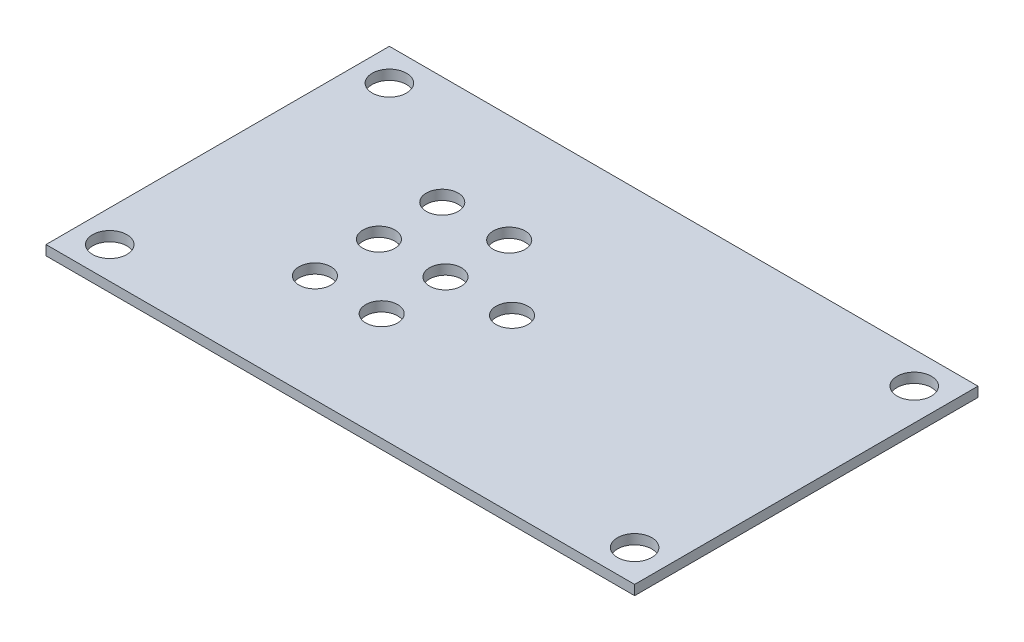
ISO-10303-21;
HEADER;
FILE_DESCRIPTION(('STEP AP214'),'2;1');
FILE_NAME('part.step','',(''),(''),'','','');
FILE_SCHEMA(('AUTOMOTIVE_DESIGN { 1 0 10303 214 1 1 1 1 }'));
ENDSEC;
DATA;
#1=APPLICATION_CONTEXT('core data for automotive mechanical design processes');
#2=APPLICATION_PROTOCOL_DEFINITION('international standard','automotive_design',2000,#1);
#3=PRODUCT_CONTEXT('',#1,'mechanical');
#4=PRODUCT('Part','Part','',(#3));
#5=PRODUCT_RELATED_PRODUCT_CATEGORY('part','',(#4));
#6=PRODUCT_DEFINITION_FORMATION('','',#4);
#7=PRODUCT_DEFINITION_CONTEXT('part definition',#1,'design');
#8=PRODUCT_DEFINITION('design','',#6,#7);
#9=PRODUCT_DEFINITION_SHAPE('','',#8);
#10=(LENGTH_UNIT() NAMED_UNIT(*) SI_UNIT(.MILLI.,.METRE.));
#11=(NAMED_UNIT(*) PLANE_ANGLE_UNIT() SI_UNIT($,.RADIAN.));
#12=(NAMED_UNIT(*) SI_UNIT($,.STERADIAN.) SOLID_ANGLE_UNIT());
#13=UNCERTAINTY_MEASURE_WITH_UNIT(LENGTH_MEASURE(1.E-05),#10,'distance_accuracy_value','');
#14=(GEOMETRIC_REPRESENTATION_CONTEXT(3) GLOBAL_UNCERTAINTY_ASSIGNED_CONTEXT((#13)) GLOBAL_UNIT_ASSIGNED_CONTEXT((#10,
#11,#12)) REPRESENTATION_CONTEXT('',''));
#15=CARTESIAN_POINT('',(0.,0.,0.));
#16=DIRECTION('',(0.,0.,1.));
#17=DIRECTION('',(1.,0.,0.));
#18=AXIS2_PLACEMENT_3D('',#15,#16,#17);
#19=CARTESIAN_POINT('',(-60.,2.,-35.));
#20=DIRECTION('',(0.,0.,-1.));
#21=DIRECTION('',(-1.,0.,0.));
#22=AXIS2_PLACEMENT_3D('',#19,#20,#21);
#23=PLANE('',#22);
#24=DIRECTION('',(1.,0.,0.));
#25=VECTOR('',#24,1.);
#26=CARTESIAN_POINT('',(-60.,0.,-35.));
#27=LINE('',#26,#25);
#28=CARTESIAN_POINT('',(-60.,0.,-35.));
#29=VERTEX_POINT('',#28);
#30=CARTESIAN_POINT('',(60.,0.,-35.));
#31=VERTEX_POINT('',#30);
#32=EDGE_CURVE('E104',#29,#31,#27,.T.);
#33=ORIENTED_EDGE('',*,*,#32,.F.);
#34=DIRECTION('',(0.,-1.,0.));
#35=VECTOR('',#34,1.);
#36=CARTESIAN_POINT('',(-60.,2.,-35.));
#37=LINE('',#36,#35);
#38=CARTESIAN_POINT('',(-60.,2.,-35.));
#39=VERTEX_POINT('',#38);
#40=EDGE_CURVE('E51',#39,#29,#37,.T.);
#41=ORIENTED_EDGE('',*,*,#40,.F.);
#42=DIRECTION('',(1.,0.,0.));
#43=VECTOR('',#42,1.);
#44=CARTESIAN_POINT('',(-60.,2.,-35.));
#45=LINE('',#44,#43);
#46=CARTESIAN_POINT('',(60.,2.,-35.));
#47=VERTEX_POINT('',#46);
#48=EDGE_CURVE('E98',#39,#47,#45,.T.);
#49=ORIENTED_EDGE('',*,*,#48,.T.);
#50=DIRECTION('',(0.,-1.,0.));
#51=VECTOR('',#50,1.);
#52=CARTESIAN_POINT('',(60.,2.,-35.));
#53=LINE('',#52,#51);
#54=EDGE_CURVE('E76',#47,#31,#53,.T.);
#55=ORIENTED_EDGE('',*,*,#54,.T.);
#56=EDGE_LOOP('',(#33,#41,#49,#55));
#57=FACE_BOUND('',#56,.T.);
#58=ADVANCED_FACE('F33',(#57),#23,.T.);
#59=CARTESIAN_POINT('',(-60.,2.,-35.));
#60=DIRECTION('',(1.,0.,0.));
#61=DIRECTION('',(0.,0.,-1.));
#62=AXIS2_PLACEMENT_3D('',#59,#60,#61);
#63=PLANE('',#62);
#64=DIRECTION('',(0.,0.,1.));
#65=VECTOR('',#64,1.);
#66=CARTESIAN_POINT('',(-60.,0.,-35.));
#67=LINE('',#66,#65);
#68=CARTESIAN_POINT('',(-60.,0.,35.));
#69=VERTEX_POINT('',#68);
#70=EDGE_CURVE('E68',#29,#69,#67,.T.);
#71=ORIENTED_EDGE('',*,*,#70,.T.);
#72=DIRECTION('',(0.,-1.,0.));
#73=VECTOR('',#72,1.);
#74=CARTESIAN_POINT('',(-60.,2.,35.));
#75=LINE('',#74,#73);
#76=CARTESIAN_POINT('',(-60.,2.,35.));
#77=VERTEX_POINT('',#76);
#78=EDGE_CURVE('E95',#77,#69,#75,.T.);
#79=ORIENTED_EDGE('',*,*,#78,.F.);
#80=DIRECTION('',(0.,0.,1.));
#81=VECTOR('',#80,1.);
#82=CARTESIAN_POINT('',(-60.,2.,-35.));
#83=LINE('',#82,#81);
#84=EDGE_CURVE('E86',#39,#77,#83,.T.);
#85=ORIENTED_EDGE('',*,*,#84,.F.);
#86=ORIENTED_EDGE('',*,*,#40,.T.);
#87=EDGE_LOOP('',(#71,#79,#85,#86));
#88=FACE_BOUND('',#87,.T.);
#89=ADVANCED_FACE('F189',(#88),#63,.F.);
#90=CARTESIAN_POINT('',(-60.,2.,35.));
#91=DIRECTION('',(0.,0.,-1.));
#92=DIRECTION('',(-1.,0.,0.));
#93=AXIS2_PLACEMENT_3D('',#90,#91,#92);
#94=PLANE('',#93);
#95=DIRECTION('',(1.,0.,0.));
#96=VECTOR('',#95,1.);
#97=CARTESIAN_POINT('',(-60.,0.,35.));
#98=LINE('',#97,#96);
#99=CARTESIAN_POINT('',(60.,0.,35.));
#100=VERTEX_POINT('',#99);
#101=EDGE_CURVE('E93',#69,#100,#98,.T.);
#102=ORIENTED_EDGE('',*,*,#101,.T.);
#103=DIRECTION('',(0.,-1.,0.));
#104=VECTOR('',#103,1.);
#105=CARTESIAN_POINT('',(60.,2.,35.));
#106=LINE('',#105,#104);
#107=CARTESIAN_POINT('',(60.,2.,35.));
#108=VERTEX_POINT('',#107);
#109=EDGE_CURVE('E90',#108,#100,#106,.T.);
#110=ORIENTED_EDGE('',*,*,#109,.F.);
#111=DIRECTION('',(1.,0.,0.));
#112=VECTOR('',#111,1.);
#113=CARTESIAN_POINT('',(-60.,2.,35.));
#114=LINE('',#113,#112);
#115=EDGE_CURVE('E81',#77,#108,#114,.T.);
#116=ORIENTED_EDGE('',*,*,#115,.F.);
#117=ORIENTED_EDGE('',*,*,#78,.T.);
#118=EDGE_LOOP('',(#102,#110,#116,#117));
#119=FACE_BOUND('',#118,.T.);
#120=ADVANCED_FACE('F91',(#119),#94,.F.);
#121=CARTESIAN_POINT('',(60.,2.,-35.));
#122=DIRECTION('',(1.,0.,0.));
#123=DIRECTION('',(0.,0.,-1.));
#124=AXIS2_PLACEMENT_3D('',#121,#122,#123);
#125=PLANE('',#124);
#126=DIRECTION('',(0.,0.,1.));
#127=VECTOR('',#126,1.);
#128=CARTESIAN_POINT('',(60.,0.,-35.));
#129=LINE('',#128,#127);
#130=EDGE_CURVE('E107',#31,#100,#129,.T.);
#131=ORIENTED_EDGE('',*,*,#130,.F.);
#132=ORIENTED_EDGE('',*,*,#54,.F.);
#133=DIRECTION('',(0.,0.,1.));
#134=VECTOR('',#133,1.);
#135=CARTESIAN_POINT('',(60.,2.,-35.));
#136=LINE('',#135,#134);
#137=EDGE_CURVE('E85',#47,#108,#136,.T.);
#138=ORIENTED_EDGE('',*,*,#137,.T.);
#139=ORIENTED_EDGE('',*,*,#109,.T.);
#140=EDGE_LOOP('',(#131,#132,#138,#139));
#141=FACE_BOUND('',#140,.T.);
#142=ADVANCED_FACE('F97',(#141),#125,.T.);
#143=CARTESIAN_POINT('',(0.,2.,0.));
#144=DIRECTION('',(0.,-1.,0.));
#145=DIRECTION('',(0.,0.,-1.));
#146=AXIS2_PLACEMENT_3D('',#143,#144,#145);
#147=PLANE('',#146);
#148=CARTESIAN_POINT('',(-13.5670814838794,2.,13.));
#149=DIRECTION('',(0.,1.,0.));
#150=DIRECTION('',(0.,0.,1.));
#151=AXIS2_PLACEMENT_3D('',#148,#149,#150);
#152=CIRCLE('',#151,3.25);
#153=CARTESIAN_POINT('',(-13.5670814838794,2.,16.25));
#154=VERTEX_POINT('',#153);
#155=EDGE_CURVE('E367',#154,#154,#152,.T.);
#156=ORIENTED_EDGE('',*,*,#155,.F.);
#157=EDGE_LOOP('',(#156));
#158=FACE_BOUND('',#157,.T.);
#159=CARTESIAN_POINT('',(-27.0544480874395,2.,13.1222734091497));
#160=DIRECTION('',(0.,1.,0.));
#161=DIRECTION('',(0.,0.,1.));
#162=AXIS2_PLACEMENT_3D('',#159,#160,#161);
#163=CIRCLE('',#162,3.25);
#164=CARTESIAN_POINT('',(-27.0544480874395,2.,16.3722734091497));
#165=VERTEX_POINT('',#164);
#166=EDGE_CURVE('E368',#165,#165,#163,.T.);
#167=ORIENTED_EDGE('',*,*,#166,.F.);
#168=EDGE_LOOP('',(#167));
#169=FACE_BOUND('',#168,.T.);
#170=CARTESIAN_POINT('',(-27.0234830475948,2.,0.107647129916502));
#171=DIRECTION('',(0.,1.,0.));
#172=DIRECTION('',(0.,0.,1.));
#173=AXIS2_PLACEMENT_3D('',#170,#171,#172);
#174=CIRCLE('',#173,3.25);
#175=CARTESIAN_POINT('',(-27.0234830475948,2.,3.3576471299165));
#176=VERTEX_POINT('',#175);
#177=EDGE_CURVE('E370',#176,#176,#174,.T.);
#178=ORIENTED_EDGE('',*,*,#177,.F.);
#179=EDGE_LOOP('',(#178));
#180=FACE_BOUND('',#179,.T.);
#181=CARTESIAN_POINT('',(-27.0815622735967,2.,-12.8640198972437));
#182=DIRECTION('',(0.,1.,0.));
#183=DIRECTION('',(0.,0.,1.));
#184=AXIS2_PLACEMENT_3D('',#181,#182,#183);
#185=CIRCLE('',#184,3.25);
#186=CARTESIAN_POINT('',(-27.0815622735967,2.,-9.6140198972437));
#187=VERTEX_POINT('',#186);
#188=EDGE_CURVE('E375',#187,#187,#185,.T.);
#189=ORIENTED_EDGE('',*,*,#188,.F.);
#190=EDGE_LOOP('',(#189));
#191=FACE_BOUND('',#190,.T.);
#192=CARTESIAN_POINT('',(0.,2.,0.));
#193=DIRECTION('',(0.,1.,0.));
#194=DIRECTION('',(0.,0.,1.));
#195=AXIS2_PLACEMENT_3D('',#192,#193,#194);
#196=CIRCLE('',#195,3.25);
#197=CARTESIAN_POINT('',(0.,2.,3.25));
#198=VERTEX_POINT('',#197);
#199=EDGE_CURVE('E378',#198,#198,#196,.T.);
#200=ORIENTED_EDGE('',*,*,#199,.F.);
#201=EDGE_LOOP('',(#200));
#202=FACE_BOUND('',#201,.T.);
#203=CARTESIAN_POINT('',(-13.5670814838794,2.,0.));
#204=DIRECTION('',(0.,1.,0.));
#205=DIRECTION('',(0.,0.,1.));
#206=AXIS2_PLACEMENT_3D('',#203,#204,#205);
#207=CIRCLE('',#206,3.25);
#208=CARTESIAN_POINT('',(-13.5670814838794,2.,3.25));
#209=VERTEX_POINT('',#208);
#210=EDGE_CURVE('E381',#209,#209,#207,.T.);
#211=ORIENTED_EDGE('',*,*,#210,.F.);
#212=EDGE_LOOP('',(#211));
#213=FACE_BOUND('',#212,.T.);
#214=CARTESIAN_POINT('',(-13.5670814838794,2.,-13.));
#215=DIRECTION('',(0.,1.,0.));
#216=DIRECTION('',(0.,0.,1.));
#217=AXIS2_PLACEMENT_3D('',#214,#215,#216);
#218=CIRCLE('',#217,3.25);
#219=CARTESIAN_POINT('',(-13.5670814838794,2.,-9.75));
#220=VERTEX_POINT('',#219);
#221=EDGE_CURVE('E133',#220,#220,#218,.T.);
#222=ORIENTED_EDGE('',*,*,#221,.F.);
#223=EDGE_LOOP('',(#222));
#224=FACE_BOUND('',#223,.T.);
#225=CARTESIAN_POINT('',(53.5,2.,28.5));
#226=DIRECTION('',(0.,1.,0.));
#227=DIRECTION('',(0.,0.,1.));
#228=AXIS2_PLACEMENT_3D('',#225,#226,#227);
#229=CIRCLE('',#228,3.5);
#230=CARTESIAN_POINT('',(53.5,2.,32.));
#231=VERTEX_POINT('',#230);
#232=EDGE_CURVE('E158',#231,#231,#229,.T.);
#233=ORIENTED_EDGE('',*,*,#232,.F.);
#234=EDGE_LOOP('',(#233));
#235=FACE_BOUND('',#234,.T.);
#236=CARTESIAN_POINT('',(-53.5,2.,-28.5));
#237=DIRECTION('',(0.,1.,0.));
#238=DIRECTION('',(0.,0.,1.));
#239=AXIS2_PLACEMENT_3D('',#236,#237,#238);
#240=CIRCLE('',#239,3.5);
#241=CARTESIAN_POINT('',(-53.5,2.,-25.));
#242=VERTEX_POINT('',#241);
#243=EDGE_CURVE('E166',#242,#242,#240,.T.);
#244=ORIENTED_EDGE('',*,*,#243,.F.);
#245=EDGE_LOOP('',(#244));
#246=FACE_BOUND('',#245,.T.);
#247=CARTESIAN_POINT('',(-53.5,2.,28.5));
#248=DIRECTION('',(0.,1.,0.));
#249=DIRECTION('',(0.,0.,1.));
#250=AXIS2_PLACEMENT_3D('',#247,#248,#249);
#251=CIRCLE('',#250,3.5);
#252=CARTESIAN_POINT('',(-53.5,2.,32.));
#253=VERTEX_POINT('',#252);
#254=EDGE_CURVE('E163',#253,#253,#251,.T.);
#255=ORIENTED_EDGE('',*,*,#254,.F.);
#256=EDGE_LOOP('',(#255));
#257=FACE_BOUND('',#256,.T.);
#258=CARTESIAN_POINT('',(53.5,2.,-28.5));
#259=DIRECTION('',(0.,1.,0.));
#260=DIRECTION('',(0.,0.,1.));
#261=AXIS2_PLACEMENT_3D('',#258,#259,#260);
#262=CIRCLE('',#261,3.5);
#263=CARTESIAN_POINT('',(53.5,2.,-25.));
#264=VERTEX_POINT('',#263);
#265=EDGE_CURVE('E119',#264,#264,#262,.T.);
#266=ORIENTED_EDGE('',*,*,#265,.F.);
#267=EDGE_LOOP('',(#266));
#268=FACE_BOUND('',#267,.T.);
#269=ORIENTED_EDGE('',*,*,#48,.F.);
#270=ORIENTED_EDGE('',*,*,#84,.T.);
#271=ORIENTED_EDGE('',*,*,#115,.T.);
#272=ORIENTED_EDGE('',*,*,#137,.F.);
#273=EDGE_LOOP('',(#269,#270,#271,#272));
#274=FACE_BOUND('',#273,.T.);
#275=ADVANCED_FACE('F84',(#158,#169,#180,#191,#202,#213,#224,#235,#246,#257,#268,#274),#147,.F.);
#276=CARTESIAN_POINT('',(0.,0.,0.));
#277=DIRECTION('',(0.,-1.,0.));
#278=DIRECTION('',(0.,0.,-1.));
#279=AXIS2_PLACEMENT_3D('',#276,#277,#278);
#280=PLANE('',#279);
#281=CARTESIAN_POINT('',(-13.5670814838794,0.,13.));
#282=DIRECTION('',(0.,-1.,0.));
#283=DIRECTION('',(0.,0.,-1.));
#284=AXIS2_PLACEMENT_3D('',#281,#282,#283);
#285=CIRCLE('',#284,3.25);
#286=CARTESIAN_POINT('',(-13.5670814838794,0.,9.75));
#287=VERTEX_POINT('',#286);
#288=EDGE_CURVE('E36',#287,#287,#285,.T.);
#289=ORIENTED_EDGE('',*,*,#288,.F.);
#290=EDGE_LOOP('',(#289));
#291=FACE_BOUND('',#290,.T.);
#292=CARTESIAN_POINT('',(-27.0544480874395,0.,13.1222734091497));
#293=DIRECTION('',(0.,-1.,0.));
#294=DIRECTION('',(0.,0.,-1.));
#295=AXIS2_PLACEMENT_3D('',#292,#293,#294);
#296=CIRCLE('',#295,3.25);
#297=CARTESIAN_POINT('',(-27.0544480874395,0.,9.87227340914968));
#298=VERTEX_POINT('',#297);
#299=EDGE_CURVE('E144',#298,#298,#296,.T.);
#300=ORIENTED_EDGE('',*,*,#299,.F.);
#301=EDGE_LOOP('',(#300));
#302=FACE_BOUND('',#301,.T.);
#303=CARTESIAN_POINT('',(-27.0234830475948,0.,0.107647129916502));
#304=DIRECTION('',(0.,-1.,0.));
#305=DIRECTION('',(0.,0.,-1.));
#306=AXIS2_PLACEMENT_3D('',#303,#304,#305);
#307=CIRCLE('',#306,3.25);
#308=CARTESIAN_POINT('',(-27.0234830475948,0.,-3.1423528700835));
#309=VERTEX_POINT('',#308);
#310=EDGE_CURVE('E142',#309,#309,#307,.T.);
#311=ORIENTED_EDGE('',*,*,#310,.F.);
#312=EDGE_LOOP('',(#311));
#313=FACE_BOUND('',#312,.T.);
#314=CARTESIAN_POINT('',(-27.0815622735967,0.,-12.8640198972437));
#315=DIRECTION('',(0.,-1.,0.));
#316=DIRECTION('',(0.,0.,-1.));
#317=AXIS2_PLACEMENT_3D('',#314,#315,#316);
#318=CIRCLE('',#317,3.25);
#319=CARTESIAN_POINT('',(-27.0815622735967,0.,-16.1140198972437));
#320=VERTEX_POINT('',#319);
#321=EDGE_CURVE('E139',#320,#320,#318,.T.);
#322=ORIENTED_EDGE('',*,*,#321,.F.);
#323=EDGE_LOOP('',(#322));
#324=FACE_BOUND('',#323,.T.);
#325=CARTESIAN_POINT('',(0.,0.,0.));
#326=DIRECTION('',(0.,-1.,0.));
#327=DIRECTION('',(0.,0.,-1.));
#328=AXIS2_PLACEMENT_3D('',#325,#326,#327);
#329=CIRCLE('',#328,3.25);
#330=CARTESIAN_POINT('',(0.,0.,-3.25));
#331=VERTEX_POINT('',#330);
#332=EDGE_CURVE('E136',#331,#331,#329,.T.);
#333=ORIENTED_EDGE('',*,*,#332,.F.);
#334=EDGE_LOOP('',(#333));
#335=FACE_BOUND('',#334,.T.);
#336=CARTESIAN_POINT('',(-13.5670814838794,0.,0.));
#337=DIRECTION('',(0.,-1.,0.));
#338=DIRECTION('',(0.,0.,-1.));
#339=AXIS2_PLACEMENT_3D('',#336,#337,#338);
#340=CIRCLE('',#339,3.25);
#341=CARTESIAN_POINT('',(-13.5670814838794,0.,-3.25));
#342=VERTEX_POINT('',#341);
#343=EDGE_CURVE('E132',#342,#342,#340,.T.);
#344=ORIENTED_EDGE('',*,*,#343,.F.);
#345=EDGE_LOOP('',(#344));
#346=FACE_BOUND('',#345,.T.);
#347=CARTESIAN_POINT('',(-13.5670814838794,0.,-13.));
#348=DIRECTION('',(0.,-1.,0.));
#349=DIRECTION('',(0.,0.,-1.));
#350=AXIS2_PLACEMENT_3D('',#347,#348,#349);
#351=CIRCLE('',#350,3.25);
#352=CARTESIAN_POINT('',(-13.5670814838794,0.,-16.25));
#353=VERTEX_POINT('',#352);
#354=EDGE_CURVE('E129',#353,#353,#351,.T.);
#355=ORIENTED_EDGE('',*,*,#354,.F.);
#356=EDGE_LOOP('',(#355));
#357=FACE_BOUND('',#356,.T.);
#358=CARTESIAN_POINT('',(0.,0.,-13.));
#359=DIRECTION('',(0.,-1.,0.));
#360=DIRECTION('',(0.,0.,-1.));
#361=AXIS2_PLACEMENT_3D('',#358,#359,#360);
#362=CIRCLE('',#361,2.);
#363=CARTESIAN_POINT('',(0.,0.,-15.));
#364=VERTEX_POINT('',#363);
#365=EDGE_CURVE('E11',#364,#364,#362,.T.);
#366=ORIENTED_EDGE('',*,*,#365,.F.);
#367=EDGE_LOOP('',(#366));
#368=FACE_BOUND('',#367,.T.);
#369=CARTESIAN_POINT('',(0.,0.,13.));
#370=DIRECTION('',(0.,-1.,0.));
#371=DIRECTION('',(0.,0.,-1.));
#372=AXIS2_PLACEMENT_3D('',#369,#370,#371);
#373=CIRCLE('',#372,2.);
#374=CARTESIAN_POINT('',(0.,0.,11.));
#375=VERTEX_POINT('',#374);
#376=EDGE_CURVE('E42',#375,#375,#373,.T.);
#377=ORIENTED_EDGE('',*,*,#376,.F.);
#378=EDGE_LOOP('',(#377));
#379=FACE_BOUND('',#378,.T.);
#380=CARTESIAN_POINT('',(53.5,0.,28.5));
#381=DIRECTION('',(0.,-1.,0.));
#382=DIRECTION('',(0.,0.,-1.));
#383=AXIS2_PLACEMENT_3D('',#380,#381,#382);
#384=CIRCLE('',#383,3.5);
#385=CARTESIAN_POINT('',(53.5,0.,25.));
#386=VERTEX_POINT('',#385);
#387=EDGE_CURVE('E108',#386,#386,#384,.T.);
#388=ORIENTED_EDGE('',*,*,#387,.F.);
#389=EDGE_LOOP('',(#388));
#390=FACE_BOUND('',#389,.T.);
#391=CARTESIAN_POINT('',(-53.5,0.,-28.5));
#392=DIRECTION('',(0.,-1.,0.));
#393=DIRECTION('',(0.,0.,-1.));
#394=AXIS2_PLACEMENT_3D('',#391,#392,#393);
#395=CIRCLE('',#394,3.5);
#396=CARTESIAN_POINT('',(-53.5,0.,-32.));
#397=VERTEX_POINT('',#396);
#398=EDGE_CURVE('E122',#397,#397,#395,.T.);
#399=ORIENTED_EDGE('',*,*,#398,.F.);
#400=EDGE_LOOP('',(#399));
#401=FACE_BOUND('',#400,.T.);
#402=CARTESIAN_POINT('',(-53.5,0.,28.5));
#403=DIRECTION('',(0.,-1.,0.));
#404=DIRECTION('',(0.,0.,-1.));
#405=AXIS2_PLACEMENT_3D('',#402,#403,#404);
#406=CIRCLE('',#405,3.5);
#407=CARTESIAN_POINT('',(-53.5,0.,25.));
#408=VERTEX_POINT('',#407);
#409=EDGE_CURVE('E118',#408,#408,#406,.T.);
#410=ORIENTED_EDGE('',*,*,#409,.F.);
#411=EDGE_LOOP('',(#410));
#412=FACE_BOUND('',#411,.T.);
#413=CARTESIAN_POINT('',(53.5,0.,-28.5));
#414=DIRECTION('',(0.,-1.,0.));
#415=DIRECTION('',(0.,0.,-1.));
#416=AXIS2_PLACEMENT_3D('',#413,#414,#415);
#417=CIRCLE('',#416,3.5);
#418=CARTESIAN_POINT('',(53.5,0.,-32.));
#419=VERTEX_POINT('',#418);
#420=EDGE_CURVE('E115',#419,#419,#417,.T.);
#421=ORIENTED_EDGE('',*,*,#420,.F.);
#422=EDGE_LOOP('',(#421));
#423=FACE_BOUND('',#422,.T.);
#424=ORIENTED_EDGE('',*,*,#32,.T.);
#425=ORIENTED_EDGE('',*,*,#130,.T.);
#426=ORIENTED_EDGE('',*,*,#101,.F.);
#427=ORIENTED_EDGE('',*,*,#70,.F.);
#428=EDGE_LOOP('',(#424,#425,#426,#427));
#429=FACE_BOUND('',#428,.T.);
#430=ADVANCED_FACE('F176',(#291,#302,#313,#324,#335,#346,#357,#368,#379,#390,#401,#412,#423,
#429),#280,.T.);
#431=CARTESIAN_POINT('',(53.5,-1.,-28.5));
#432=DIRECTION('',(0.,1.,0.));
#433=DIRECTION('',(0.,0.,1.));
#434=AXIS2_PLACEMENT_3D('',#431,#432,#433);
#435=CYLINDRICAL_SURFACE('',#434,3.5);
#436=ORIENTED_EDGE('',*,*,#420,.T.);
#437=EDGE_LOOP('',(#436));
#438=FACE_BOUND('',#437,.T.);
#439=ORIENTED_EDGE('',*,*,#265,.T.);
#440=EDGE_LOOP('',(#439));
#441=FACE_BOUND('',#440,.T.);
#442=ADVANCED_FACE('F173',(#438,#441),#435,.F.);
#443=CARTESIAN_POINT('',(-53.5,-1.,28.5));
#444=DIRECTION('',(0.,1.,0.));
#445=DIRECTION('',(0.,0.,1.));
#446=AXIS2_PLACEMENT_3D('',#443,#444,#445);
#447=CYLINDRICAL_SURFACE('',#446,3.5);
#448=ORIENTED_EDGE('',*,*,#409,.T.);
#449=EDGE_LOOP('',(#448));
#450=FACE_BOUND('',#449,.T.);
#451=ORIENTED_EDGE('',*,*,#254,.T.);
#452=EDGE_LOOP('',(#451));
#453=FACE_BOUND('',#452,.T.);
#454=ADVANCED_FACE('F215',(#450,#453),#447,.F.);
#455=CARTESIAN_POINT('',(-53.5,-1.,-28.5));
#456=DIRECTION('',(0.,1.,0.));
#457=DIRECTION('',(0.,0.,1.));
#458=AXIS2_PLACEMENT_3D('',#455,#456,#457);
#459=CYLINDRICAL_SURFACE('',#458,3.5);
#460=ORIENTED_EDGE('',*,*,#398,.T.);
#461=EDGE_LOOP('',(#460));
#462=FACE_BOUND('',#461,.T.);
#463=ORIENTED_EDGE('',*,*,#243,.T.);
#464=EDGE_LOOP('',(#463));
#465=FACE_BOUND('',#464,.T.);
#466=ADVANCED_FACE('F225',(#462,#465),#459,.F.);
#467=CARTESIAN_POINT('',(53.5,-1.,28.5));
#468=DIRECTION('',(0.,1.,0.));
#469=DIRECTION('',(0.,0.,1.));
#470=AXIS2_PLACEMENT_3D('',#467,#468,#469);
#471=CYLINDRICAL_SURFACE('',#470,3.5);
#472=ORIENTED_EDGE('',*,*,#387,.T.);
#473=EDGE_LOOP('',(#472));
#474=FACE_BOUND('',#473,.T.);
#475=ORIENTED_EDGE('',*,*,#232,.T.);
#476=EDGE_LOOP('',(#475));
#477=FACE_BOUND('',#476,.T.);
#478=ADVANCED_FACE('F235',(#474,#477),#471,.F.);
#479=CARTESIAN_POINT('',(0.,-9.,13.));
#480=DIRECTION('',(0.,1.,0.));
#481=DIRECTION('',(0.,0.,1.));
#482=AXIS2_PLACEMENT_3D('',#479,#480,#481);
#483=CYLINDRICAL_SURFACE('',#482,2.);
#484=ORIENTED_EDGE('',*,*,#376,.T.);
#485=EDGE_LOOP('',(#484));
#486=FACE_BOUND('',#485,.T.);
#487=CARTESIAN_POINT('',(0.,-9.,13.));
#488=DIRECTION('',(0.,1.,0.));
#489=DIRECTION('',(0.,0.,1.));
#490=AXIS2_PLACEMENT_3D('',#487,#488,#489);
#491=CIRCLE('',#490,2.);
#492=CARTESIAN_POINT('',(0.,-9.,15.));
#493=VERTEX_POINT('',#492);
#494=EDGE_CURVE('E153',#493,#493,#491,.T.);
#495=ORIENTED_EDGE('',*,*,#494,.T.);
#496=EDGE_LOOP('',(#495));
#497=FACE_BOUND('',#496,.T.);
#498=ADVANCED_FACE('F245',(#486,#497),#483,.T.);
#499=CARTESIAN_POINT('',(0.,-9.,13.));
#500=DIRECTION('',(0.,1.,0.));
#501=DIRECTION('',(0.,0.,1.));
#502=AXIS2_PLACEMENT_3D('',#499,#500,#501);
#503=PLANE('',#502);
#504=ORIENTED_EDGE('',*,*,#494,.F.);
#505=EDGE_LOOP('',(#504));
#506=FACE_BOUND('',#505,.T.);
#507=ADVANCED_FACE('F255',(#506),#503,.F.);
#508=CARTESIAN_POINT('',(0.,-9.,-13.));
#509=DIRECTION('',(0.,1.,0.));
#510=DIRECTION('',(0.,0.,1.));
#511=AXIS2_PLACEMENT_3D('',#508,#509,#510);
#512=CYLINDRICAL_SURFACE('',#511,2.);
#513=ORIENTED_EDGE('',*,*,#365,.T.);
#514=EDGE_LOOP('',(#513));
#515=FACE_BOUND('',#514,.T.);
#516=CARTESIAN_POINT('',(0.,-9.,-13.));
#517=DIRECTION('',(0.,1.,0.));
#518=DIRECTION('',(0.,0.,1.));
#519=AXIS2_PLACEMENT_3D('',#516,#517,#518);
#520=CIRCLE('',#519,2.);
#521=CARTESIAN_POINT('',(0.,-9.,-11.));
#522=VERTEX_POINT('',#521);
#523=EDGE_CURVE('E149',#522,#522,#520,.T.);
#524=ORIENTED_EDGE('',*,*,#523,.T.);
#525=EDGE_LOOP('',(#524));
#526=FACE_BOUND('',#525,.T.);
#527=ADVANCED_FACE('F265',(#515,#526),#512,.T.);
#528=CARTESIAN_POINT('',(0.,-9.,-13.));
#529=DIRECTION('',(0.,1.,0.));
#530=DIRECTION('',(0.,0.,1.));
#531=AXIS2_PLACEMENT_3D('',#528,#529,#530);
#532=PLANE('',#531);
#533=ORIENTED_EDGE('',*,*,#523,.F.);
#534=EDGE_LOOP('',(#533));
#535=FACE_BOUND('',#534,.T.);
#536=ADVANCED_FACE('F275',(#535),#532,.F.);
#537=CARTESIAN_POINT('',(-13.5670814838794,-9.,-13.));
#538=DIRECTION('',(0.,1.,0.));
#539=DIRECTION('',(0.,0.,1.));
#540=AXIS2_PLACEMENT_3D('',#537,#538,#539);
#541=CYLINDRICAL_SURFACE('',#540,3.25);
#542=ORIENTED_EDGE('',*,*,#354,.T.);
#543=EDGE_LOOP('',(#542));
#544=FACE_BOUND('',#543,.T.);
#545=ORIENTED_EDGE('',*,*,#221,.T.);
#546=EDGE_LOOP('',(#545));
#547=FACE_BOUND('',#546,.T.);
#548=ADVANCED_FACE('F284',(#544,#547),#541,.F.);
#549=CARTESIAN_POINT('',(-13.5670814838794,-9.,0.));
#550=DIRECTION('',(0.,1.,0.));
#551=DIRECTION('',(0.,0.,1.));
#552=AXIS2_PLACEMENT_3D('',#549,#550,#551);
#553=CYLINDRICAL_SURFACE('',#552,3.25);
#554=ORIENTED_EDGE('',*,*,#343,.T.);
#555=EDGE_LOOP('',(#554));
#556=FACE_BOUND('',#555,.T.);
#557=ORIENTED_EDGE('',*,*,#210,.T.);
#558=EDGE_LOOP('',(#557));
#559=FACE_BOUND('',#558,.T.);
#560=ADVANCED_FACE('F303',(#556,#559),#553,.F.);
#561=CARTESIAN_POINT('',(0.,-9.,0.));
#562=DIRECTION('',(0.,1.,0.));
#563=DIRECTION('',(0.,0.,1.));
#564=AXIS2_PLACEMENT_3D('',#561,#562,#563);
#565=CYLINDRICAL_SURFACE('',#564,3.25);
#566=ORIENTED_EDGE('',*,*,#332,.T.);
#567=EDGE_LOOP('',(#566));
#568=FACE_BOUND('',#567,.T.);
#569=ORIENTED_EDGE('',*,*,#199,.T.);
#570=EDGE_LOOP('',(#569));
#571=FACE_BOUND('',#570,.T.);
#572=ADVANCED_FACE('F313',(#568,#571),#565,.F.);
#573=CARTESIAN_POINT('',(-27.0815622735967,-9.,-12.8640198972437));
#574=DIRECTION('',(0.,1.,0.));
#575=DIRECTION('',(0.,0.,1.));
#576=AXIS2_PLACEMENT_3D('',#573,#574,#575);
#577=CYLINDRICAL_SURFACE('',#576,3.25);
#578=ORIENTED_EDGE('',*,*,#321,.T.);
#579=EDGE_LOOP('',(#578));
#580=FACE_BOUND('',#579,.T.);
#581=ORIENTED_EDGE('',*,*,#188,.T.);
#582=EDGE_LOOP('',(#581));
#583=FACE_BOUND('',#582,.T.);
#584=ADVANCED_FACE('F323',(#580,#583),#577,.F.);
#585=CARTESIAN_POINT('',(-27.0234830475948,-9.,0.107647129916502));
#586=DIRECTION('',(0.,1.,0.));
#587=DIRECTION('',(0.,0.,1.));
#588=AXIS2_PLACEMENT_3D('',#585,#586,#587);
#589=CYLINDRICAL_SURFACE('',#588,3.25);
#590=ORIENTED_EDGE('',*,*,#310,.T.);
#591=EDGE_LOOP('',(#590));
#592=FACE_BOUND('',#591,.T.);
#593=ORIENTED_EDGE('',*,*,#177,.T.);
#594=EDGE_LOOP('',(#593));
#595=FACE_BOUND('',#594,.T.);
#596=ADVANCED_FACE('F333',(#592,#595),#589,.F.);
#597=CARTESIAN_POINT('',(-27.0544480874395,-9.,13.1222734091497));
#598=DIRECTION('',(0.,1.,0.));
#599=DIRECTION('',(0.,0.,1.));
#600=AXIS2_PLACEMENT_3D('',#597,#598,#599);
#601=CYLINDRICAL_SURFACE('',#600,3.25);
#602=ORIENTED_EDGE('',*,*,#299,.T.);
#603=EDGE_LOOP('',(#602));
#604=FACE_BOUND('',#603,.T.);
#605=ORIENTED_EDGE('',*,*,#166,.T.);
#606=EDGE_LOOP('',(#605));
#607=FACE_BOUND('',#606,.T.);
#608=ADVANCED_FACE('F343',(#604,#607),#601,.F.);
#609=CARTESIAN_POINT('',(-13.5670814838794,-9.,13.));
#610=DIRECTION('',(0.,1.,0.));
#611=DIRECTION('',(0.,0.,1.));
#612=AXIS2_PLACEMENT_3D('',#609,#610,#611);
#613=CYLINDRICAL_SURFACE('',#612,3.25);
#614=ORIENTED_EDGE('',*,*,#288,.T.);
#615=EDGE_LOOP('',(#614));
#616=FACE_BOUND('',#615,.T.);
#617=ORIENTED_EDGE('',*,*,#155,.T.);
#618=EDGE_LOOP('',(#617));
#619=FACE_BOUND('',#618,.T.);
#620=ADVANCED_FACE('F353',(#616,#619),#613,.F.);
#621=CLOSED_SHELL('',(#58,#89,#120,#142,#275,#430,#442,#454,#466,#478,#498,#507,#527,#536,#548,
#560,#572,#584,#596,#608,#620));
#622=MANIFOLD_SOLID_BREP('B2',#621);
#623=ADVANCED_BREP_SHAPE_REPRESENTATION('',(#18,#622),#14);
#624=SHAPE_DEFINITION_REPRESENTATION(#9,#623);
ENDSEC;
END-ISO-10303-21;
